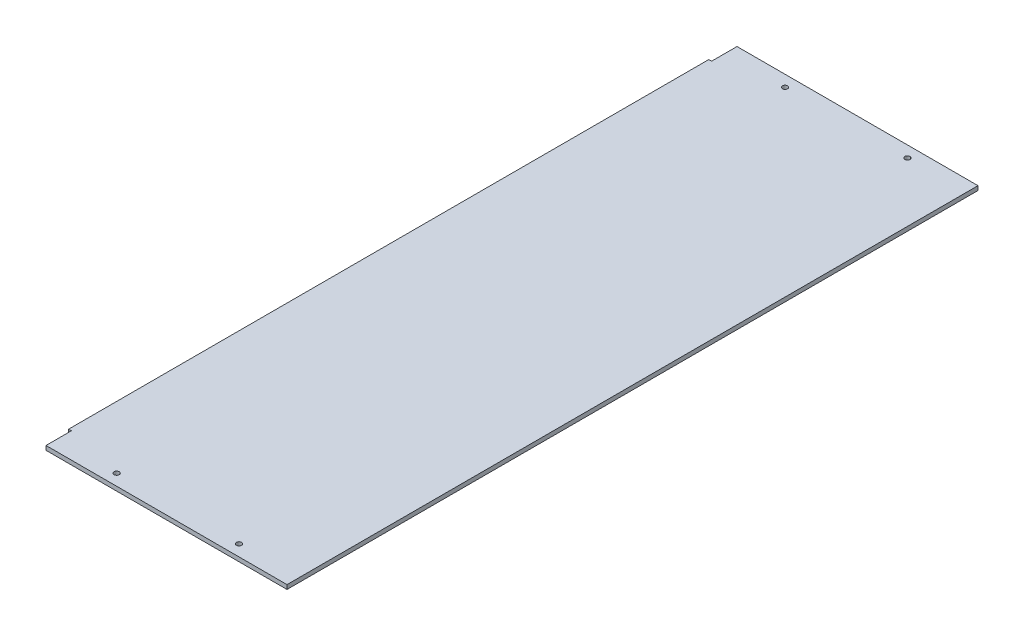
ISO-10303-21;
HEADER;
FILE_DESCRIPTION(('STEP AP214'),'2;1');
FILE_NAME('part.step','',(''),(''),'','','');
FILE_SCHEMA(('AUTOMOTIVE_DESIGN { 1 0 10303 214 1 1 1 1 }'));
ENDSEC;
DATA;
#1=APPLICATION_CONTEXT('core data for automotive mechanical design processes');
#2=APPLICATION_PROTOCOL_DEFINITION('international standard','automotive_design',2000,#1);
#3=PRODUCT_CONTEXT('',#1,'mechanical');
#4=PRODUCT('Part','Part','',(#3));
#5=PRODUCT_RELATED_PRODUCT_CATEGORY('part','',(#4));
#6=PRODUCT_DEFINITION_FORMATION('','',#4);
#7=PRODUCT_DEFINITION_CONTEXT('part definition',#1,'design');
#8=PRODUCT_DEFINITION('design','',#6,#7);
#9=PRODUCT_DEFINITION_SHAPE('','',#8);
#10=(LENGTH_UNIT() NAMED_UNIT(*) SI_UNIT(.MILLI.,.METRE.));
#11=(NAMED_UNIT(*) PLANE_ANGLE_UNIT() SI_UNIT($,.RADIAN.));
#12=(NAMED_UNIT(*) SI_UNIT($,.STERADIAN.) SOLID_ANGLE_UNIT());
#13=UNCERTAINTY_MEASURE_WITH_UNIT(LENGTH_MEASURE(1.E-05),#10,'distance_accuracy_value','');
#14=(GEOMETRIC_REPRESENTATION_CONTEXT(3) GLOBAL_UNCERTAINTY_ASSIGNED_CONTEXT((#13)) GLOBAL_UNIT_ASSIGNED_CONTEXT((#10,
#11,#12)) REPRESENTATION_CONTEXT('',''));
#15=CARTESIAN_POINT('',(0.,0.,0.));
#16=DIRECTION('',(0.,0.,1.));
#17=DIRECTION('',(1.,0.,0.));
#18=AXIS2_PLACEMENT_3D('',#15,#16,#17);
#19=CARTESIAN_POINT('',(0.,4.5,0.));
#20=DIRECTION('',(0.,1.,0.));
#21=DIRECTION('',(0.,0.,1.));
#22=AXIS2_PLACEMENT_3D('',#19,#20,#21);
#23=PLANE('',#22);
#24=CARTESIAN_POINT('',(65.,4.5,379.));
#25=DIRECTION('',(0.,1.,0.));
#26=DIRECTION('',(0.,0.,1.));
#27=AXIS2_PLACEMENT_3D('',#24,#25,#26);
#28=CIRCLE('',#27,2.75000000000001);
#29=CARTESIAN_POINT('',(65.,4.5,381.75));
#30=VERTEX_POINT('',#29);
#31=EDGE_CURVE('E188',#30,#30,#28,.T.);
#32=ORIENTED_EDGE('',*,*,#31,.F.);
#33=EDGE_LOOP('',(#32));
#34=FACE_BOUND('',#33,.T.);
#35=CARTESIAN_POINT('',(-65.,4.5,-331.));
#36=DIRECTION('',(0.,1.,0.));
#37=DIRECTION('',(0.,0.,1.));
#38=AXIS2_PLACEMENT_3D('',#35,#36,#37);
#39=CIRCLE('',#38,2.75);
#40=CARTESIAN_POINT('',(-65.,4.5,-328.25));
#41=VERTEX_POINT('',#40);
#42=EDGE_CURVE('E134',#41,#41,#39,.T.);
#43=ORIENTED_EDGE('',*,*,#42,.F.);
#44=EDGE_LOOP('',(#43));
#45=FACE_BOUND('',#44,.T.);
#46=DIRECTION('',(0.,0.,-1.));
#47=VECTOR('',#46,1.);
#48=CARTESIAN_POINT('',(128.,4.5,-343.));
#49=LINE('',#48,#47);
#50=CARTESIAN_POINT('',(128.,4.5,391.));
#51=VERTEX_POINT('',#50);
#52=CARTESIAN_POINT('',(128.,4.5,-343.));
#53=VERTEX_POINT('',#52);
#54=EDGE_CURVE('E145',#51,#53,#49,.T.);
#55=ORIENTED_EDGE('',*,*,#54,.T.);
#56=DIRECTION('',(-1.,0.,0.));
#57=VECTOR('',#56,1.);
#58=CARTESIAN_POINT('',(-128.,4.5,-343.));
#59=LINE('',#58,#57);
#60=CARTESIAN_POINT('',(-128.,4.5,-343.));
#61=VERTEX_POINT('',#60);
#62=EDGE_CURVE('E93',#53,#61,#59,.T.);
#63=ORIENTED_EDGE('',*,*,#62,.T.);
#64=DIRECTION('',(0.,0.,1.));
#65=VECTOR('',#64,1.);
#66=CARTESIAN_POINT('',(-128.,4.5,-343.));
#67=LINE('',#66,#65);
#68=CARTESIAN_POINT('',(-128.,4.5,-316.));
#69=VERTEX_POINT('',#68);
#70=EDGE_CURVE('E160',#61,#69,#67,.T.);
#71=ORIENTED_EDGE('',*,*,#70,.T.);
#72=DIRECTION('',(-1.,0.,0.));
#73=VECTOR('',#72,1.);
#74=CARTESIAN_POINT('',(-131.,4.5,-316.));
#75=LINE('',#74,#73);
#76=CARTESIAN_POINT('',(-131.,4.5,-316.));
#77=VERTEX_POINT('',#76);
#78=EDGE_CURVE('E173',#69,#77,#75,.T.);
#79=ORIENTED_EDGE('',*,*,#78,.T.);
#80=DIRECTION('',(0.,0.,1.));
#81=VECTOR('',#80,1.);
#82=CARTESIAN_POINT('',(-131.,4.5,-316.));
#83=LINE('',#82,#81);
#84=CARTESIAN_POINT('',(-131.,4.5,364.));
#85=VERTEX_POINT('',#84);
#86=EDGE_CURVE('E112',#77,#85,#83,.T.);
#87=ORIENTED_EDGE('',*,*,#86,.T.);
#88=DIRECTION('',(1.,0.,0.));
#89=VECTOR('',#88,1.);
#90=CARTESIAN_POINT('',(-131.,4.5,364.));
#91=LINE('',#90,#89);
#92=CARTESIAN_POINT('',(-128.,4.5,364.));
#93=VERTEX_POINT('',#92);
#94=EDGE_CURVE('E106',#85,#93,#91,.T.);
#95=ORIENTED_EDGE('',*,*,#94,.T.);
#96=DIRECTION('',(0.,0.,1.));
#97=VECTOR('',#96,1.);
#98=CARTESIAN_POINT('',(-128.,4.5,391.));
#99=LINE('',#98,#97);
#100=CARTESIAN_POINT('',(-128.,4.5,391.));
#101=VERTEX_POINT('',#100);
#102=EDGE_CURVE('E110',#93,#101,#99,.T.);
#103=ORIENTED_EDGE('',*,*,#102,.T.);
#104=DIRECTION('',(1.,0.,0.));
#105=VECTOR('',#104,1.);
#106=CARTESIAN_POINT('',(-128.,4.5,391.));
#107=LINE('',#106,#105);
#108=EDGE_CURVE('E50',#101,#51,#107,.T.);
#109=ORIENTED_EDGE('',*,*,#108,.T.);
#110=EDGE_LOOP('',(#55,#63,#71,#79,#87,#95,#103,#109));
#111=FACE_BOUND('',#110,.T.);
#112=CARTESIAN_POINT('',(65.,4.5,-331.));
#113=DIRECTION('',(0.,1.,0.));
#114=DIRECTION('',(0.,0.,-1.));
#115=AXIS2_PLACEMENT_3D('',#112,#113,#114);
#116=CIRCLE('',#115,2.75000000000001);
#117=CARTESIAN_POINT('',(65.,4.5,-333.75));
#118=VERTEX_POINT('',#117);
#119=EDGE_CURVE('E182',#118,#118,#116,.T.);
#120=ORIENTED_EDGE('',*,*,#119,.F.);
#121=EDGE_LOOP('',(#120));
#122=FACE_BOUND('',#121,.T.);
#123=CARTESIAN_POINT('',(-65.,4.5,379.));
#124=DIRECTION('',(0.,1.,0.));
#125=DIRECTION('',(0.,0.,-1.));
#126=AXIS2_PLACEMENT_3D('',#123,#124,#125);
#127=CIRCLE('',#126,2.75);
#128=CARTESIAN_POINT('',(-65.,4.5,376.25));
#129=VERTEX_POINT('',#128);
#130=EDGE_CURVE('E194',#129,#129,#127,.T.);
#131=ORIENTED_EDGE('',*,*,#130,.F.);
#132=EDGE_LOOP('',(#131));
#133=FACE_BOUND('',#132,.T.);
#134=ADVANCED_FACE('F33',(#34,#45,#111,#122,#133),#23,.T.);
#135=CARTESIAN_POINT('',(0.,0.,0.));
#136=DIRECTION('',(0.,1.,0.));
#137=DIRECTION('',(0.,0.,1.));
#138=AXIS2_PLACEMENT_3D('',#135,#136,#137);
#139=PLANE('',#138);
#140=DIRECTION('',(0.,0.,-1.));
#141=VECTOR('',#140,1.);
#142=CARTESIAN_POINT('',(128.,0.,-343.));
#143=LINE('',#142,#141);
#144=CARTESIAN_POINT('',(128.,0.,391.));
#145=VERTEX_POINT('',#144);
#146=CARTESIAN_POINT('',(128.,0.,-343.));
#147=VERTEX_POINT('',#146);
#148=EDGE_CURVE('E130',#145,#147,#143,.T.);
#149=ORIENTED_EDGE('',*,*,#148,.F.);
#150=DIRECTION('',(1.,0.,0.));
#151=VECTOR('',#150,1.);
#152=CARTESIAN_POINT('',(-128.,0.,391.));
#153=LINE('',#152,#151);
#154=CARTESIAN_POINT('',(-128.,0.,391.));
#155=VERTEX_POINT('',#154);
#156=EDGE_CURVE('E85',#155,#145,#153,.T.);
#157=ORIENTED_EDGE('',*,*,#156,.F.);
#158=DIRECTION('',(0.,0.,1.));
#159=VECTOR('',#158,1.);
#160=CARTESIAN_POINT('',(-128.,0.,391.));
#161=LINE('',#160,#159);
#162=CARTESIAN_POINT('',(-128.,0.,364.));
#163=VERTEX_POINT('',#162);
#164=EDGE_CURVE('E79',#163,#155,#161,.T.);
#165=ORIENTED_EDGE('',*,*,#164,.F.);
#166=DIRECTION('',(1.,0.,0.));
#167=VECTOR('',#166,1.);
#168=CARTESIAN_POINT('',(-131.,0.,364.));
#169=LINE('',#168,#167);
#170=CARTESIAN_POINT('',(-131.,0.,364.));
#171=VERTEX_POINT('',#170);
#172=EDGE_CURVE('E120',#171,#163,#169,.T.);
#173=ORIENTED_EDGE('',*,*,#172,.F.);
#174=DIRECTION('',(0.,0.,1.));
#175=VECTOR('',#174,1.);
#176=CARTESIAN_POINT('',(-131.,0.,-316.));
#177=LINE('',#176,#175);
#178=CARTESIAN_POINT('',(-131.,0.,-316.));
#179=VERTEX_POINT('',#178);
#180=EDGE_CURVE('E140',#179,#171,#177,.T.);
#181=ORIENTED_EDGE('',*,*,#180,.F.);
#182=DIRECTION('',(-1.,0.,0.));
#183=VECTOR('',#182,1.);
#184=CARTESIAN_POINT('',(-131.,0.,-316.));
#185=LINE('',#184,#183);
#186=CARTESIAN_POINT('',(-128.,0.,-316.));
#187=VERTEX_POINT('',#186);
#188=EDGE_CURVE('E138',#187,#179,#185,.T.);
#189=ORIENTED_EDGE('',*,*,#188,.F.);
#190=DIRECTION('',(0.,0.,1.));
#191=VECTOR('',#190,1.);
#192=CARTESIAN_POINT('',(-128.,0.,-343.));
#193=LINE('',#192,#191);
#194=CARTESIAN_POINT('',(-128.,0.,-343.));
#195=VERTEX_POINT('',#194);
#196=EDGE_CURVE('E136',#195,#187,#193,.T.);
#197=ORIENTED_EDGE('',*,*,#196,.F.);
#198=DIRECTION('',(-1.,0.,0.));
#199=VECTOR('',#198,1.);
#200=CARTESIAN_POINT('',(-128.,0.,-343.));
#201=LINE('',#200,#199);
#202=EDGE_CURVE('E133',#147,#195,#201,.T.);
#203=ORIENTED_EDGE('',*,*,#202,.F.);
#204=EDGE_LOOP('',(#149,#157,#165,#173,#181,#189,#197,#203));
#205=FACE_BOUND('',#204,.T.);
#206=CARTESIAN_POINT('',(-65.,0.,-331.));
#207=DIRECTION('',(0.,1.,0.));
#208=DIRECTION('',(0.,0.,1.));
#209=AXIS2_PLACEMENT_3D('',#206,#207,#208);
#210=CIRCLE('',#209,2.75);
#211=CARTESIAN_POINT('',(-65.,0.,-328.25));
#212=VERTEX_POINT('',#211);
#213=EDGE_CURVE('E179',#212,#212,#210,.T.);
#214=ORIENTED_EDGE('',*,*,#213,.T.);
#215=EDGE_LOOP('',(#214));
#216=FACE_BOUND('',#215,.T.);
#217=CARTESIAN_POINT('',(65.,0.,-331.));
#218=DIRECTION('',(0.,1.,0.));
#219=DIRECTION('',(0.,0.,-1.));
#220=AXIS2_PLACEMENT_3D('',#217,#218,#219);
#221=CIRCLE('',#220,2.75000000000001);
#222=CARTESIAN_POINT('',(65.,0.,-333.75));
#223=VERTEX_POINT('',#222);
#224=EDGE_CURVE('E185',#223,#223,#221,.T.);
#225=ORIENTED_EDGE('',*,*,#224,.T.);
#226=EDGE_LOOP('',(#225));
#227=FACE_BOUND('',#226,.T.);
#228=CARTESIAN_POINT('',(65.,0.,379.));
#229=DIRECTION('',(0.,1.,0.));
#230=DIRECTION('',(0.,0.,1.));
#231=AXIS2_PLACEMENT_3D('',#228,#229,#230);
#232=CIRCLE('',#231,2.75000000000001);
#233=CARTESIAN_POINT('',(65.,0.,381.75));
#234=VERTEX_POINT('',#233);
#235=EDGE_CURVE('E191',#234,#234,#232,.T.);
#236=ORIENTED_EDGE('',*,*,#235,.T.);
#237=EDGE_LOOP('',(#236));
#238=FACE_BOUND('',#237,.T.);
#239=CARTESIAN_POINT('',(-65.,0.,379.));
#240=DIRECTION('',(0.,1.,0.));
#241=DIRECTION('',(0.,0.,-1.));
#242=AXIS2_PLACEMENT_3D('',#239,#240,#241);
#243=CIRCLE('',#242,2.75);
#244=CARTESIAN_POINT('',(-65.,0.,376.25));
#245=VERTEX_POINT('',#244);
#246=EDGE_CURVE('E197',#245,#245,#243,.T.);
#247=ORIENTED_EDGE('',*,*,#246,.T.);
#248=EDGE_LOOP('',(#247));
#249=FACE_BOUND('',#248,.T.);
#250=ADVANCED_FACE('F164',(#205,#216,#227,#238,#249),#139,.F.);
#251=CARTESIAN_POINT('',(128.,4.5,-343.));
#252=DIRECTION('',(-1.,0.,0.));
#253=DIRECTION('',(0.,0.,1.));
#254=AXIS2_PLACEMENT_3D('',#251,#252,#253);
#255=PLANE('',#254);
#256=ORIENTED_EDGE('',*,*,#148,.T.);
#257=DIRECTION('',(0.,-1.,0.));
#258=VECTOR('',#257,1.);
#259=CARTESIAN_POINT('',(128.,4.5,-343.));
#260=LINE('',#259,#258);
#261=EDGE_CURVE('E11',#53,#147,#260,.T.);
#262=ORIENTED_EDGE('',*,*,#261,.F.);
#263=ORIENTED_EDGE('',*,*,#54,.F.);
#264=DIRECTION('',(0.,-1.,0.));
#265=VECTOR('',#264,1.);
#266=CARTESIAN_POINT('',(128.,4.5,391.));
#267=LINE('',#266,#265);
#268=EDGE_CURVE('E126',#51,#145,#267,.T.);
#269=ORIENTED_EDGE('',*,*,#268,.T.);
#270=EDGE_LOOP('',(#256,#262,#263,#269));
#271=FACE_BOUND('',#270,.T.);
#272=ADVANCED_FACE('F35',(#271),#255,.F.);
#273=CARTESIAN_POINT('',(-128.,4.5,-343.));
#274=DIRECTION('',(0.,0.,1.));
#275=DIRECTION('',(1.,0.,0.));
#276=AXIS2_PLACEMENT_3D('',#273,#274,#275);
#277=PLANE('',#276);
#278=ORIENTED_EDGE('',*,*,#202,.T.);
#279=DIRECTION('',(0.,-1.,0.));
#280=VECTOR('',#279,1.);
#281=CARTESIAN_POINT('',(-128.,4.5,-343.));
#282=LINE('',#281,#280);
#283=EDGE_CURVE('E42',#61,#195,#282,.T.);
#284=ORIENTED_EDGE('',*,*,#283,.F.);
#285=ORIENTED_EDGE('',*,*,#62,.F.);
#286=ORIENTED_EDGE('',*,*,#261,.T.);
#287=EDGE_LOOP('',(#278,#284,#285,#286));
#288=FACE_BOUND('',#287,.T.);
#289=ADVANCED_FACE('F231',(#288),#277,.F.);
#290=CARTESIAN_POINT('',(-128.,4.5,-343.));
#291=DIRECTION('',(1.,0.,0.));
#292=DIRECTION('',(0.,0.,-1.));
#293=AXIS2_PLACEMENT_3D('',#290,#291,#292);
#294=PLANE('',#293);
#295=ORIENTED_EDGE('',*,*,#196,.T.);
#296=DIRECTION('',(0.,-1.,0.));
#297=VECTOR('',#296,1.);
#298=CARTESIAN_POINT('',(-128.,4.5,-316.));
#299=LINE('',#298,#297);
#300=EDGE_CURVE('E152',#69,#187,#299,.T.);
#301=ORIENTED_EDGE('',*,*,#300,.F.);
#302=ORIENTED_EDGE('',*,*,#70,.F.);
#303=ORIENTED_EDGE('',*,*,#283,.T.);
#304=EDGE_LOOP('',(#295,#301,#302,#303));
#305=FACE_BOUND('',#304,.T.);
#306=ADVANCED_FACE('F158',(#305),#294,.F.);
#307=CARTESIAN_POINT('',(-131.,4.5,-316.));
#308=DIRECTION('',(0.,0.,1.));
#309=DIRECTION('',(1.,0.,0.));
#310=AXIS2_PLACEMENT_3D('',#307,#308,#309);
#311=PLANE('',#310);
#312=ORIENTED_EDGE('',*,*,#188,.T.);
#313=DIRECTION('',(0.,-1.,0.));
#314=VECTOR('',#313,1.);
#315=CARTESIAN_POINT('',(-131.,4.5,-316.));
#316=LINE('',#315,#314);
#317=EDGE_CURVE('E149',#77,#179,#316,.T.);
#318=ORIENTED_EDGE('',*,*,#317,.F.);
#319=ORIENTED_EDGE('',*,*,#78,.F.);
#320=ORIENTED_EDGE('',*,*,#300,.T.);
#321=EDGE_LOOP('',(#312,#318,#319,#320));
#322=FACE_BOUND('',#321,.T.);
#323=ADVANCED_FACE('F169',(#322),#311,.F.);
#324=CARTESIAN_POINT('',(-131.,4.5,-316.));
#325=DIRECTION('',(1.,0.,0.));
#326=DIRECTION('',(0.,0.,-1.));
#327=AXIS2_PLACEMENT_3D('',#324,#325,#326);
#328=PLANE('',#327);
#329=ORIENTED_EDGE('',*,*,#180,.T.);
#330=DIRECTION('',(0.,-1.,0.));
#331=VECTOR('',#330,1.);
#332=CARTESIAN_POINT('',(-131.,4.5,364.));
#333=LINE('',#332,#331);
#334=EDGE_CURVE('E121',#85,#171,#333,.T.);
#335=ORIENTED_EDGE('',*,*,#334,.F.);
#336=ORIENTED_EDGE('',*,*,#86,.F.);
#337=ORIENTED_EDGE('',*,*,#317,.T.);
#338=EDGE_LOOP('',(#329,#335,#336,#337));
#339=FACE_BOUND('',#338,.T.);
#340=ADVANCED_FACE('F172',(#339),#328,.F.);
#341=CARTESIAN_POINT('',(-131.,4.5,364.));
#342=DIRECTION('',(0.,0.,-1.));
#343=DIRECTION('',(-1.,0.,0.));
#344=AXIS2_PLACEMENT_3D('',#341,#342,#343);
#345=PLANE('',#344);
#346=ORIENTED_EDGE('',*,*,#172,.T.);
#347=DIRECTION('',(0.,-1.,0.));
#348=VECTOR('',#347,1.);
#349=CARTESIAN_POINT('',(-128.,4.5,364.));
#350=LINE('',#349,#348);
#351=EDGE_CURVE('E117',#93,#163,#350,.T.);
#352=ORIENTED_EDGE('',*,*,#351,.F.);
#353=ORIENTED_EDGE('',*,*,#94,.F.);
#354=ORIENTED_EDGE('',*,*,#334,.T.);
#355=EDGE_LOOP('',(#346,#352,#353,#354));
#356=FACE_BOUND('',#355,.T.);
#357=ADVANCED_FACE('F118',(#356),#345,.F.);
#358=CARTESIAN_POINT('',(-128.,4.5,391.));
#359=DIRECTION('',(1.,0.,0.));
#360=DIRECTION('',(0.,0.,-1.));
#361=AXIS2_PLACEMENT_3D('',#358,#359,#360);
#362=PLANE('',#361);
#363=ORIENTED_EDGE('',*,*,#164,.T.);
#364=DIRECTION('',(0.,-1.,0.));
#365=VECTOR('',#364,1.);
#366=CARTESIAN_POINT('',(-128.,4.5,391.));
#367=LINE('',#366,#365);
#368=EDGE_CURVE('E122',#101,#155,#367,.T.);
#369=ORIENTED_EDGE('',*,*,#368,.F.);
#370=ORIENTED_EDGE('',*,*,#102,.F.);
#371=ORIENTED_EDGE('',*,*,#351,.T.);
#372=EDGE_LOOP('',(#363,#369,#370,#371));
#373=FACE_BOUND('',#372,.T.);
#374=ADVANCED_FACE('F124',(#373),#362,.F.);
#375=CARTESIAN_POINT('',(-128.,4.5,391.));
#376=DIRECTION('',(0.,0.,-1.));
#377=DIRECTION('',(-1.,0.,0.));
#378=AXIS2_PLACEMENT_3D('',#375,#376,#377);
#379=PLANE('',#378);
#380=ORIENTED_EDGE('',*,*,#156,.T.);
#381=ORIENTED_EDGE('',*,*,#268,.F.);
#382=ORIENTED_EDGE('',*,*,#108,.F.);
#383=ORIENTED_EDGE('',*,*,#368,.T.);
#384=EDGE_LOOP('',(#380,#381,#382,#383));
#385=FACE_BOUND('',#384,.T.);
#386=ADVANCED_FACE('F219',(#385),#379,.F.);
#387=CARTESIAN_POINT('',(-65.,4.5,-331.));
#388=DIRECTION('',(0.,-1.,0.));
#389=DIRECTION('',(0.,0.,-1.));
#390=AXIS2_PLACEMENT_3D('',#387,#388,#389);
#391=CYLINDRICAL_SURFACE('',#390,2.75);
#392=ORIENTED_EDGE('',*,*,#42,.T.);
#393=EDGE_LOOP('',(#392));
#394=FACE_BOUND('',#393,.T.);
#395=ORIENTED_EDGE('',*,*,#213,.F.);
#396=EDGE_LOOP('',(#395));
#397=FACE_BOUND('',#396,.T.);
#398=ADVANCED_FACE('F216',(#394,#397),#391,.F.);
#399=CARTESIAN_POINT('',(65.,4.5,-331.));
#400=DIRECTION('',(0.,-1.,0.));
#401=DIRECTION('',(0.,0.,-1.));
#402=AXIS2_PLACEMENT_3D('',#399,#400,#401);
#403=CYLINDRICAL_SURFACE('',#402,2.75000000000001);
#404=ORIENTED_EDGE('',*,*,#119,.T.);
#405=EDGE_LOOP('',(#404));
#406=FACE_BOUND('',#405,.T.);
#407=ORIENTED_EDGE('',*,*,#224,.F.);
#408=EDGE_LOOP('',(#407));
#409=FACE_BOUND('',#408,.T.);
#410=ADVANCED_FACE('F295',(#406,#409),#403,.F.);
#411=CARTESIAN_POINT('',(65.,4.5,379.));
#412=DIRECTION('',(0.,-1.,0.));
#413=DIRECTION('',(0.,0.,-1.));
#414=AXIS2_PLACEMENT_3D('',#411,#412,#413);
#415=CYLINDRICAL_SURFACE('',#414,2.75000000000001);
#416=ORIENTED_EDGE('',*,*,#31,.T.);
#417=EDGE_LOOP('',(#416));
#418=FACE_BOUND('',#417,.T.);
#419=ORIENTED_EDGE('',*,*,#235,.F.);
#420=EDGE_LOOP('',(#419));
#421=FACE_BOUND('',#420,.T.);
#422=ADVANCED_FACE('F303',(#418,#421),#415,.F.);
#423=CARTESIAN_POINT('',(-65.,4.5,379.));
#424=DIRECTION('',(0.,-1.,0.));
#425=DIRECTION('',(0.,0.,-1.));
#426=AXIS2_PLACEMENT_3D('',#423,#424,#425);
#427=CYLINDRICAL_SURFACE('',#426,2.75);
#428=ORIENTED_EDGE('',*,*,#130,.T.);
#429=EDGE_LOOP('',(#428));
#430=FACE_BOUND('',#429,.T.);
#431=ORIENTED_EDGE('',*,*,#246,.F.);
#432=EDGE_LOOP('',(#431));
#433=FACE_BOUND('',#432,.T.);
#434=ADVANCED_FACE('F203',(#430,#433),#427,.F.);
#435=CLOSED_SHELL('',(#134,#250,#272,#289,#306,#323,#340,#357,#374,#386,#398,#410,#422,#434));
#436=MANIFOLD_SOLID_BREP('B2',#435);
#437=ADVANCED_BREP_SHAPE_REPRESENTATION('',(#18,#436),#14);
#438=SHAPE_DEFINITION_REPRESENTATION(#9,#437);
ENDSEC;
END-ISO-10303-21;
